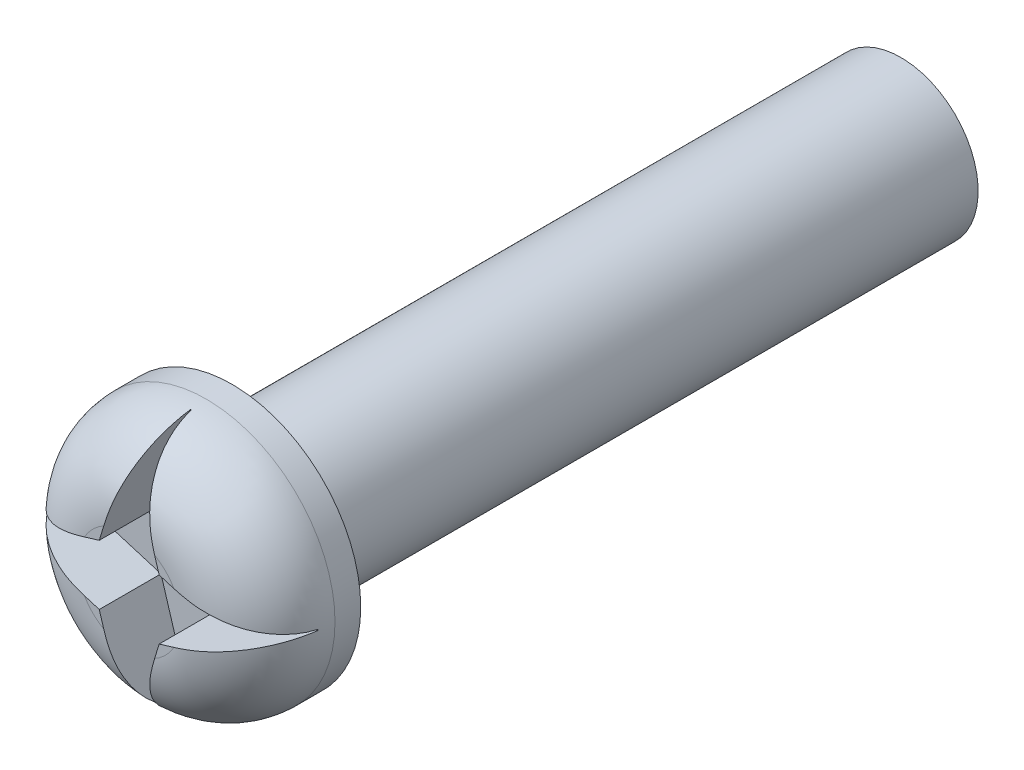
ISO-10303-21;
HEADER;
FILE_DESCRIPTION(('STEP AP214'),'2;1');
FILE_NAME('part.step','',(''),(''),'','','');
FILE_SCHEMA(('AUTOMOTIVE_DESIGN { 1 0 10303 214 1 1 1 1 }'));
ENDSEC;
DATA;
#1=APPLICATION_CONTEXT('core data for automotive mechanical design processes');
#2=APPLICATION_PROTOCOL_DEFINITION('international standard','automotive_design',2000,#1);
#3=PRODUCT_CONTEXT('',#1,'mechanical');
#4=PRODUCT('Part','Part','',(#3));
#5=PRODUCT_RELATED_PRODUCT_CATEGORY('part','',(#4));
#6=PRODUCT_DEFINITION_FORMATION('','',#4);
#7=PRODUCT_DEFINITION_CONTEXT('part definition',#1,'design');
#8=PRODUCT_DEFINITION('design','',#6,#7);
#9=PRODUCT_DEFINITION_SHAPE('','',#8);
#10=(LENGTH_UNIT() NAMED_UNIT(*) SI_UNIT(.MILLI.,.METRE.));
#11=(NAMED_UNIT(*) PLANE_ANGLE_UNIT() SI_UNIT($,.RADIAN.));
#12=(NAMED_UNIT(*) SI_UNIT($,.STERADIAN.) SOLID_ANGLE_UNIT());
#13=UNCERTAINTY_MEASURE_WITH_UNIT(LENGTH_MEASURE(1.E-05),#10,'distance_accuracy_value','');
#14=(GEOMETRIC_REPRESENTATION_CONTEXT(3) GLOBAL_UNCERTAINTY_ASSIGNED_CONTEXT((#13)) GLOBAL_UNIT_ASSIGNED_CONTEXT((#10,
#11,#12)) REPRESENTATION_CONTEXT('',''));
#15=CARTESIAN_POINT('',(0.,0.,0.));
#16=DIRECTION('',(0.,0.,1.));
#17=DIRECTION('',(1.,0.,0.));
#18=AXIS2_PLACEMENT_3D('',#15,#16,#17);
#19=CARTESIAN_POINT('',(0.,0.,15.));
#20=DIRECTION('',(0.,0.,1.));
#21=DIRECTION('',(1.,0.,0.));
#22=AXIS2_PLACEMENT_3D('',#19,#20,#21);
#23=PLANE('',#22);
#24=DIRECTION('',(-0.290235125811715,0.956955365597089,0.));
#25=VECTOR('',#24,1.);
#26=CARTESIAN_POINT('',(0.,2.5,15.));
#27=LINE('',#26,#25);
#28=CARTESIAN_POINT('',(0.581777859539059,0.581777859539081,15.));
#29=VERTEX_POINT('',#28);
#30=CARTESIAN_POINT('',(0.494635776143097,0.869100367598194,15.));
#31=VERTEX_POINT('',#30);
#32=EDGE_CURVE('E158',#29,#31,#27,.T.);
#33=ORIENTED_EDGE('',*,*,#32,.F.);
#34=DIRECTION('',(-0.956955365597085,0.290235125811726,0.));
#35=VECTOR('',#34,1.);
#36=CARTESIAN_POINT('',(2.5,0.,15.));
#37=LINE('',#36,#35);
#38=CARTESIAN_POINT('',(0.869100367598186,0.494635776143112,15.));
#39=VERTEX_POINT('',#38);
#40=EDGE_CURVE('E171',#39,#29,#37,.T.);
#41=ORIENTED_EDGE('',*,*,#40,.F.);
#42=CARTESIAN_POINT('',(0.,0.,15.));
#43=DIRECTION('',(0.,0.,1.));
#44=DIRECTION('',(1.,0.,0.));
#45=AXIS2_PLACEMENT_3D('',#42,#43,#44);
#46=CIRCLE('',#45,1.);
#47=EDGE_CURVE('E191',#39,#31,#46,.T.);
#48=ORIENTED_EDGE('',*,*,#47,.T.);
#49=EDGE_LOOP('',(#33,#41,#48));
#50=FACE_BOUND('',#49,.T.);
#51=ADVANCED_FACE('F33',(#50),#23,.T.);
#52=DIRECTION('',(0.956955365597089,0.290235125811715,0.));
#53=VECTOR('',#52,1.);
#54=CARTESIAN_POINT('',(2.5,0.,15.));
#55=LINE('',#54,#53);
#56=CARTESIAN_POINT('',(0.581777859539066,-0.581777859539073,15.));
#57=VERTEX_POINT('',#56);
#58=CARTESIAN_POINT('',(0.869100367598187,-0.494635776143109,15.));
#59=VERTEX_POINT('',#58);
#60=EDGE_CURVE('E169',#57,#59,#55,.T.);
#61=ORIENTED_EDGE('',*,*,#60,.F.);
#62=DIRECTION('',(0.290235125811725,0.956955365597086,0.));
#63=VECTOR('',#62,1.);
#64=CARTESIAN_POINT('',(0.,-2.5,15.));
#65=LINE('',#64,#63);
#66=CARTESIAN_POINT('',(0.494635776143099,-0.869100367598193,15.));
#67=VERTEX_POINT('',#66);
#68=EDGE_CURVE('E167',#67,#57,#65,.T.);
#69=ORIENTED_EDGE('',*,*,#68,.F.);
#70=EDGE_CURVE('E188',#67,#59,#46,.T.);
#71=ORIENTED_EDGE('',*,*,#70,.T.);
#72=EDGE_LOOP('',(#61,#69,#71));
#73=FACE_BOUND('',#72,.T.);
#74=ADVANCED_FACE('F290',(#73),#23,.T.);
#75=DIRECTION('',(0.290235125811708,-0.956955365597091,0.));
#76=VECTOR('',#75,1.);
#77=CARTESIAN_POINT('',(0.,-2.5,15.));
#78=LINE('',#77,#76);
#79=CARTESIAN_POINT('',(-0.581777859539065,-0.581777859539072,15.));
#80=VERTEX_POINT('',#79);
#81=CARTESIAN_POINT('',(-0.494635776143104,-0.86910036759819,15.));
#82=VERTEX_POINT('',#81);
#83=EDGE_CURVE('E165',#80,#82,#78,.T.);
#84=ORIENTED_EDGE('',*,*,#83,.F.);
#85=DIRECTION('',(0.956955365597084,-0.29023512581173,0.));
#86=VECTOR('',#85,1.);
#87=CARTESIAN_POINT('',(-2.5,0.,15.));
#88=LINE('',#87,#86);
#89=CARTESIAN_POINT('',(-0.869100367598192,-0.494635776143101,15.));
#90=VERTEX_POINT('',#89);
#91=EDGE_CURVE('E163',#90,#80,#88,.T.);
#92=ORIENTED_EDGE('',*,*,#91,.F.);
#93=EDGE_CURVE('E281',#90,#82,#46,.T.);
#94=ORIENTED_EDGE('',*,*,#93,.T.);
#95=EDGE_LOOP('',(#84,#92,#94));
#96=FACE_BOUND('',#95,.T.);
#97=ADVANCED_FACE('F280',(#96),#23,.T.);
#98=CARTESIAN_POINT('',(0.,0.,13.));
#99=DIRECTION('',(0.,0.,-1.));
#100=DIRECTION('',(-1.,0.,0.));
#101=AXIS2_PLACEMENT_3D('',#98,#99,#100);
#102=CYLINDRICAL_SURFACE('',#101,1.5);
#103=CARTESIAN_POINT('',(0.,0.,13.));
#104=DIRECTION('',(0.,0.,1.));
#105=DIRECTION('',(1.,0.,0.));
#106=AXIS2_PLACEMENT_3D('',#103,#104,#105);
#107=CIRCLE('',#106,1.5);
#108=CARTESIAN_POINT('',(-1.5,0.,13.));
#109=VERTEX_POINT('',#108);
#110=EDGE_CURVE('E185',#109,#109,#107,.T.);
#111=CARTESIAN_POINT('',(0.,0.,0.));
#112=DIRECTION('',(0.,0.,1.));
#113=DIRECTION('',(1.,0.,0.));
#114=AXIS2_PLACEMENT_3D('',#111,#112,#113);
#115=CIRCLE('',#114,1.5);
#116=CARTESIAN_POINT('',(-1.5,0.,0.));
#117=VERTEX_POINT('',#116);
#118=EDGE_CURVE('E184',#117,#117,#115,.T.);
#119=CARTESIAN_POINT('',(-1.5,0.,13.));
#120=CARTESIAN_POINT('',(-1.5,0.,12.8645833333333));
#121=CARTESIAN_POINT('',(-1.5,0.,12.7291666666667));
#122=CARTESIAN_POINT('',(-1.5,0.,12.4583333333333));
#123=CARTESIAN_POINT('',(-1.5,0.,12.3229166666667));
#124=CARTESIAN_POINT('',(-1.5,0.,12.0520833333333));
#125=CARTESIAN_POINT('',(-1.5,0.,11.9166666666667));
#126=CARTESIAN_POINT('',(-1.5,0.,11.6458333333333));
#127=CARTESIAN_POINT('',(-1.5,0.,11.5104166666667));
#128=CARTESIAN_POINT('',(-1.5,0.,11.2395833333333));
#129=CARTESIAN_POINT('',(-1.5,0.,11.1041666666667));
#130=CARTESIAN_POINT('',(-1.5,0.,10.8333333333333));
#131=CARTESIAN_POINT('',(-1.5,0.,10.6979166666667));
#132=CARTESIAN_POINT('',(-1.5,0.,10.4270833333333));
#133=CARTESIAN_POINT('',(-1.5,0.,10.2916666666667));
#134=CARTESIAN_POINT('',(-1.5,0.,10.0208333333333));
#135=CARTESIAN_POINT('',(-1.5,0.,9.88541666666667));
#136=CARTESIAN_POINT('',(-1.5,0.,9.61458333333333));
#137=CARTESIAN_POINT('',(-1.5,0.,9.47916666666667));
#138=CARTESIAN_POINT('',(-1.5,0.,9.20833333333333));
#139=CARTESIAN_POINT('',(-1.5,0.,9.07291666666666));
#140=CARTESIAN_POINT('',(-1.5,0.,8.80208333333333));
#141=CARTESIAN_POINT('',(-1.5,0.,8.66666666666667));
#142=CARTESIAN_POINT('',(-1.5,0.,8.39583333333333));
#143=CARTESIAN_POINT('',(-1.5,0.,8.26041666666667));
#144=CARTESIAN_POINT('',(-1.5,0.,7.98958333333333));
#145=CARTESIAN_POINT('',(-1.5,0.,7.85416666666667));
#146=CARTESIAN_POINT('',(-1.5,0.,7.58333333333333));
#147=CARTESIAN_POINT('',(-1.5,0.,7.44791666666667));
#148=CARTESIAN_POINT('',(-1.5,0.,7.17708333333333));
#149=CARTESIAN_POINT('',(-1.5,0.,7.04166666666667));
#150=CARTESIAN_POINT('',(-1.5,0.,6.77083333333333));
#151=CARTESIAN_POINT('',(-1.5,0.,6.63541666666667));
#152=CARTESIAN_POINT('',(-1.5,0.,6.36458333333333));
#153=CARTESIAN_POINT('',(-1.5,0.,6.22916666666667));
#154=CARTESIAN_POINT('',(-1.5,0.,5.95833333333333));
#155=CARTESIAN_POINT('',(-1.5,0.,5.82291666666667));
#156=CARTESIAN_POINT('',(-1.5,0.,5.55208333333333));
#157=CARTESIAN_POINT('',(-1.5,0.,5.41666666666667));
#158=CARTESIAN_POINT('',(-1.5,0.,5.14583333333333));
#159=CARTESIAN_POINT('',(-1.5,0.,5.01041666666667));
#160=CARTESIAN_POINT('',(-1.5,0.,4.73958333333333));
#161=CARTESIAN_POINT('',(-1.5,0.,4.60416666666667));
#162=CARTESIAN_POINT('',(-1.5,0.,4.33333333333333));
#163=CARTESIAN_POINT('',(-1.5,0.,4.19791666666667));
#164=CARTESIAN_POINT('',(-1.5,0.,3.92708333333333));
#165=CARTESIAN_POINT('',(-1.5,0.,3.79166666666667));
#166=CARTESIAN_POINT('',(-1.5,0.,3.52083333333333));
#167=CARTESIAN_POINT('',(-1.5,0.,3.38541666666667));
#168=CARTESIAN_POINT('',(-1.5,0.,3.11458333333333));
#169=CARTESIAN_POINT('',(-1.5,0.,2.97916666666667));
#170=CARTESIAN_POINT('',(-1.5,0.,2.70833333333333));
#171=CARTESIAN_POINT('',(-1.5,0.,2.57291666666667));
#172=CARTESIAN_POINT('',(-1.5,0.,2.30208333333333));
#173=CARTESIAN_POINT('',(-1.5,0.,2.16666666666667));
#174=CARTESIAN_POINT('',(-1.5,0.,1.89583333333333));
#175=CARTESIAN_POINT('',(-1.5,0.,1.76041666666667));
#176=CARTESIAN_POINT('',(-1.5,0.,1.48958333333333));
#177=CARTESIAN_POINT('',(-1.5,0.,1.35416666666667));
#178=CARTESIAN_POINT('',(-1.5,0.,1.08333333333333));
#179=CARTESIAN_POINT('',(-1.5,0.,0.947916666666667));
#180=CARTESIAN_POINT('',(-1.5,0.,0.677083333333334));
#181=CARTESIAN_POINT('',(-1.5,0.,0.541666666666667));
#182=CARTESIAN_POINT('',(-1.5,0.,0.270833333333334));
#183=CARTESIAN_POINT('',(-1.5,0.,0.135416666666667));
#184=CARTESIAN_POINT('',(-1.5,0.,0.));
#185=B_SPLINE_CURVE_WITH_KNOTS('',3,(#119,#120,#121,#122,#123,#124,#125,#126,#127,#128,#129,
#130,#131,#132,#133,#134,#135,#136,#137,#138,#139,#140,#141,#142,#143,#144,#145,#146,#147,#148,
#149,#150,#151,#152,#153,#154,#155,#156,#157,#158,#159,#160,#161,#162,#163,#164,#165,#166,#167,
#168,#169,#170,#171,#172,#173,#174,#175,#176,#177,#178,#179,#180,#181,#182,#183,#184),
.UNSPECIFIED.,.F.,.F.,(4,2,2,2,2,2,2,2,2,2,2,2,2,2,2,2,2,2,2,2,2,2,2,2,2,2,2,2,2,2,2,2,4),(0.,
0.40625,0.812500000000001,1.21875,1.625,2.03125,2.4375,2.84375,3.25,3.65625,4.0625,4.46875,
4.875,5.28125,5.6875,6.09375,6.5,6.90625,7.3125,7.71875,8.125,8.53125,8.9375,9.34375,9.75,
10.15625,10.5625,10.96875,11.375,11.78125,12.1875,12.59375,13.),.UNSPECIFIED.);
#186=EDGE_CURVE('BSEAM321',#109,#117,#185,.T.);
#187=ORIENTED_EDGE('',*,*,#110,.F.);
#188=ORIENTED_EDGE('',*,*,#118,.T.);
#189=ORIENTED_EDGE('',*,*,#186,.T.);
#190=ORIENTED_EDGE('',*,*,#186,.F.);
#191=EDGE_LOOP('',(#187,#189,#188,#190));
#192=FACE_BOUND('',#191,.T.);
#193=ADVANCED_FACE('F321',(#192),#102,.T.);
#194=CARTESIAN_POINT('',(0.,0.,0.));
#195=DIRECTION('',(0.,0.,1.));
#196=DIRECTION('',(1.,0.,0.));
#197=AXIS2_PLACEMENT_3D('',#194,#195,#196);
#198=PLANE('',#197);
#199=ORIENTED_EDGE('',*,*,#118,.F.);
#200=EDGE_LOOP('',(#199));
#201=FACE_BOUND('',#200,.T.);
#202=ADVANCED_FACE('F316',(#201),#198,.F.);
#203=CARTESIAN_POINT('',(0.,0.,15.));
#204=DIRECTION('',(0.,0.,-1.));
#205=DIRECTION('',(-1.,0.,0.));
#206=AXIS2_PLACEMENT_3D('',#203,#204,#205);
#207=CYLINDRICAL_SURFACE('',#206,2.5);
#208=CARTESIAN_POINT('',(0.,0.,13.5));
#209=DIRECTION('',(0.,0.,1.));
#210=DIRECTION('',(1.,0.,0.));
#211=AXIS2_PLACEMENT_3D('',#208,#209,#210);
#212=CIRCLE('',#211,2.5);
#213=CARTESIAN_POINT('',(2.5,0.,13.5));
#214=VERTEX_POINT('',#213);
#215=EDGE_CURVE('E194',#214,#214,#212,.F.);
#216=ORIENTED_EDGE('',*,*,#215,.T.);
#217=EDGE_LOOP('',(#216));
#218=FACE_BOUND('',#217,.T.);
#219=CARTESIAN_POINT('',(0.,0.,13.));
#220=DIRECTION('',(0.,0.,1.));
#221=DIRECTION('',(1.,0.,0.));
#222=AXIS2_PLACEMENT_3D('',#219,#220,#221);
#223=CIRCLE('',#222,2.5);
#224=CARTESIAN_POINT('',(2.5,0.,13.));
#225=VERTEX_POINT('',#224);
#226=EDGE_CURVE('E176',#225,#225,#223,.T.);
#227=ORIENTED_EDGE('',*,*,#226,.T.);
#228=EDGE_LOOP('',(#227));
#229=FACE_BOUND('',#228,.T.);
#230=ADVANCED_FACE('F309',(#218,#229),#207,.T.);
#231=DIRECTION('',(-0.956955365597088,-0.290235125811717,0.));
#232=VECTOR('',#231,1.);
#233=CARTESIAN_POINT('',(-2.5,0.,15.));
#234=LINE('',#233,#232);
#235=CARTESIAN_POINT('',(-0.581777859539079,0.581777859539089,15.));
#236=VERTEX_POINT('',#235);
#237=CARTESIAN_POINT('',(-0.869100367598174,0.494635776143133,15.));
#238=VERTEX_POINT('',#237);
#239=EDGE_CURVE('E161',#236,#238,#234,.T.);
#240=ORIENTED_EDGE('',*,*,#239,.F.);
#241=DIRECTION('',(-0.290235125811725,-0.956955365597086,0.));
#242=VECTOR('',#241,1.);
#243=CARTESIAN_POINT('',(0.,2.5,15.));
#244=LINE('',#243,#242);
#245=CARTESIAN_POINT('',(-0.494635776143121,0.86910036759818,15.));
#246=VERTEX_POINT('',#245);
#247=EDGE_CURVE('E134',#246,#236,#244,.T.);
#248=ORIENTED_EDGE('',*,*,#247,.F.);
#249=EDGE_CURVE('E195',#246,#238,#46,.T.);
#250=ORIENTED_EDGE('',*,*,#249,.T.);
#251=EDGE_LOOP('',(#240,#248,#250));
#252=FACE_BOUND('',#251,.T.);
#253=ADVANCED_FACE('F306',(#252),#23,.T.);
#254=CARTESIAN_POINT('',(0.,0.,13.));
#255=DIRECTION('',(0.,0.,1.));
#256=DIRECTION('',(1.,0.,0.));
#257=AXIS2_PLACEMENT_3D('',#254,#255,#256);
#258=PLANE('',#257);
#259=ORIENTED_EDGE('',*,*,#110,.T.);
#260=EDGE_LOOP('',(#259));
#261=FACE_BOUND('',#260,.T.);
#262=ORIENTED_EDGE('',*,*,#226,.F.);
#263=EDGE_LOOP('',(#262));
#264=FACE_BOUND('',#263,.T.);
#265=ADVANCED_FACE('F308',(#261,#264),#258,.F.);
#266=CARTESIAN_POINT('',(0.,0.,13.5));
#267=DIRECTION('',(0.,0.,1.));
#268=DIRECTION('',(1.,0.,0.));
#269=AXIS2_PLACEMENT_3D('',#266,#267,#268);
#270=DEGENERATE_TOROIDAL_SURFACE('',#269,1.,1.5,.T.);
#271=CARTESIAN_POINT('',(0.00918435966308323,-2.46971757903322,13.7998));
#272=CARTESIAN_POINT('',(0.0116689254568649,-2.46152553625105,13.8399158307009));
#273=CARTESIAN_POINT('',(0.0146506114956408,-2.45169440211333,13.8796452640202));
#274=CARTESIAN_POINT('',(0.0215841220095333,-2.42883341976277,13.9580805517623));
#275=CARTESIAN_POINT('',(0.0255358195102427,-2.4158039902065,13.9967865394199));
#276=CARTESIAN_POINT('',(0.0387833561288206,-2.37212457265621,14.1107713827401));
#277=CARTESIAN_POINT('',(0.0494874506514517,-2.33683132323079,14.1841703739703));
#278=CARTESIAN_POINT('',(0.0743045561283554,-2.25500503780689,14.3237199604718));
#279=CARTESIAN_POINT('',(0.0884178684534007,-2.20847100813689,14.3898699141849));
#280=CARTESIAN_POINT('',(0.11962433264048,-2.10557790289465,14.5132721809844));
#281=CARTESIAN_POINT('',(0.136718946680849,-2.04921400626777,14.5705201018888));
#282=CARTESIAN_POINT('',(0.17368852549128,-1.92731891618327,14.675666432706));
#283=CARTESIAN_POINT('',(0.193607438159992,-1.86164281890913,14.7233809435215));
#284=CARTESIAN_POINT('',(0.235361492228295,-1.72397248708991,14.807248507459));
#285=CARTESIAN_POINT('',(0.257194662274962,-1.65198475243609,14.8434132806364));
#286=CARTESIAN_POINT('',(0.303460286761772,-1.49943899329847,14.9057396867572));
#287=CARTESIAN_POINT('',(0.32796994983838,-1.41862639859775,14.9312154644709));
#288=CARTESIAN_POINT('',(0.377862710195557,-1.25412134568688,14.9697719126354));
#289=CARTESIAN_POINT('',(0.403248465796886,-1.1704201225338,14.9828106428413));
#290=CARTESIAN_POINT('',(0.441523148700105,-1.04422187871916,14.9944644251529));
#291=CARTESIAN_POINT('',(0.454329305113352,-1.00199776798116,14.9970299725043));
#292=CARTESIAN_POINT('',(0.479969007432001,-0.917459238616312,14.9999414912261));
#293=CARTESIAN_POINT('',(0.49280256284035,-0.875144788656615,15.0002864949861));
#294=CARTESIAN_POINT('',(0.518351428991135,-0.7909057618347,14.9992780548217));
#295=CARTESIAN_POINT('',(0.531066818032052,-0.748980926808863,14.9979390152647));
#296=CARTESIAN_POINT('',(0.556469860848575,-0.665222704719872,14.9942759239134));
#297=CARTESIAN_POINT('',(0.569157529205893,-0.623389269578297,14.9919531521182));
#298=CARTESIAN_POINT('',(0.581838517566858,-0.581577859539073,14.9894799069656));
#299=B_SPLINE_CURVE_WITH_KNOTS('',3,(#271,#272,#273,#274,#275,#276,#277,#278,#279,#280,#281,
#282,#283,#284,#285,#286,#287,#288,#289,#290,#291,#292,#293,#294,#295,#296,#297,#298),
.UNSPECIFIED.,.F.,.F.,(4,2,2,2,2,2,2,2,2,2,2,2,2,4),(0.,0.122979479011578,0.245942868597718,
0.491102580751686,0.736283972666619,0.98158595361853,1.23124007487557,1.48064004956038,
1.74422362424766,2.00869294616106,2.14124133579937,2.27384747999228,2.4053270604389,
2.53663608717397),.UNSPECIFIED.);
#300=CARTESIAN_POINT('',(0.00919675120337278,-2.46967672198349,13.8));
#301=VERTEX_POINT('',#300);
#302=EDGE_CURVE('E11',#301,#67,#299,.T.);
#303=ORIENTED_EDGE('',*,*,#302,.F.);
#304=CARTESIAN_POINT('',(0.,0.,13.8));
#305=DIRECTION('',(0.,0.,-1.));
#306=DIRECTION('',(-1.,0.,0.));
#307=AXIS2_PLACEMENT_3D('',#304,#305,#306);
#308=CIRCLE('',#307,2.46969384566991);
#309=CARTESIAN_POINT('',(-0.00919675120340704,-2.46967672198349,13.8));
#310=VERTEX_POINT('',#309);
#311=EDGE_CURVE('E200',#310,#301,#308,.F.);
#312=ORIENTED_EDGE('',*,*,#311,.F.);
#313=CARTESIAN_POINT('',(-0.581838517566857,-0.581577859539072,14.9894799069656));
#314=CARTESIAN_POINT('',(-0.571854317041364,-0.614497494050391,14.9914177425874));
#315=CARTESIAN_POINT('',(-0.561867347937281,-0.647426257043762,14.9932729937084));
#316=CARTESIAN_POINT('',(-0.541880692645481,-0.713325713452892,14.9964682716288));
#317=CARTESIAN_POINT('',(-0.531881002420983,-0.746296420178618,14.9978079872785));
#318=CARTESIAN_POINT('',(-0.511820221816503,-0.812440280553318,14.9996238023838));
#319=CARTESIAN_POINT('',(-0.501759089225624,-0.845613573378915,15.0000952419186));
#320=CARTESIAN_POINT('',(-0.481640096252261,-0.911949369993555,14.999872200587));
#321=CARTESIAN_POINT('',(-0.471582235616266,-0.945111874618466,14.999177950472));
#322=CARTESIAN_POINT('',(-0.441227455058568,-1.04519683175442,14.9949427007751));
#323=CARTESIAN_POINT('',(-0.420948919117767,-1.11205866910347,14.9892205893121));
#324=CARTESIAN_POINT('',(-0.380706061496062,-1.24474632508703,14.9705892435361));
#325=CARTESIAN_POINT('',(-0.360741114782743,-1.31057420456143,14.9576968850162));
#326=CARTESIAN_POINT('',(-0.328390488332209,-1.41723981051,14.9299833887052));
#327=CARTESIAN_POINT('',(-0.31583600421662,-1.45863411419091,14.9174813775928));
#328=CARTESIAN_POINT('',(-0.291050007945186,-1.54035782718837,14.8890935834674));
#329=CARTESIAN_POINT('',(-0.278818613993136,-1.58068684676658,14.8732065807982));
#330=CARTESIAN_POINT('',(-0.24286806178958,-1.69922203002931,14.8205564311957));
#331=CARTESIAN_POINT('',(-0.219753991502933,-1.77543311412788,14.7786884332639));
#332=CARTESIAN_POINT('',(-0.175859446868908,-1.92016101324242,14.6815779100086));
#333=CARTESIAN_POINT('',(-0.155091689548701,-1.98863589802216,14.6262671838248));
#334=CARTESIAN_POINT('',(-0.11672489782775,-2.11513784052628,14.5035732660385));
#335=CARTESIAN_POINT('',(-0.0991316598274772,-2.17314578651663,14.4361684301891));
#336=CARTESIAN_POINT('',(-0.0687666394979736,-2.27326450594976,14.2957637953369));
#337=CARTESIAN_POINT('',(-0.0557691957928466,-2.31611932394563,14.2233408876231));
#338=CARTESIAN_POINT('',(-0.0336611591193402,-2.38901334136809,14.0719038417731));
#339=CARTESIAN_POINT('',(-0.024540647679244,-2.41908524370996,13.9929071489943));
#340=CARTESIAN_POINT('',(-0.0159018242744796,-2.44756893735839,13.8934073664307));
#341=CARTESIAN_POINT('',(-0.0144046614510589,-2.45250534191328,13.8748048523567));
#342=CARTESIAN_POINT('',(-0.011630272761113,-2.46165298086866,13.8374305848339));
#343=CARTESIAN_POINT('',(-0.0103527776068854,-2.46586510315725,13.8186590687182));
#344=CARTESIAN_POINT('',(-0.00918435966311663,-2.46971757903322,13.7998));
#345=B_SPLINE_CURVE_WITH_KNOTS('',3,(#313,#314,#315,#316,#317,#318,#319,#320,#321,#322,#323,
#324,#325,#326,#327,#328,#329,#330,#331,#332,#333,#334,#335,#336,#337,#338,#339,#340,#341,#342,
#343,#344),.UNSPECIFIED.,.F.,.F.,(4,2,2,2,2,2,2,2,2,2,2,2,2,2,2,4),(0.,0.103372404843998,
0.20680710228705,0.310795320048929,0.414762955476854,0.624757611582251,0.83426010606153,
0.969206963887304,1.1042025272893,1.37273742142197,1.64266424407984,1.91307904970278,
2.16729791208936,2.42086242629322,2.47876756279611,2.53660120009338),.UNSPECIFIED.);
#346=EDGE_CURVE('E46',#82,#310,#345,.T.);
#347=ORIENTED_EDGE('',*,*,#346,.F.);
#348=ORIENTED_EDGE('',*,*,#93,.F.);
#349=CARTESIAN_POINT('',(-2.46971757903322,-0.00918435966307469,13.7998));
#350=CARTESIAN_POINT('',(-2.46152553625105,-0.0116689254568564,13.8399158307009));
#351=CARTESIAN_POINT('',(-2.45169440211333,-0.0146506114956325,13.8796452640202));
#352=CARTESIAN_POINT('',(-2.42883341976277,-0.0215841220095251,13.9580805517623));
#353=CARTESIAN_POINT('',(-2.4158039902065,-0.0255358195102347,13.9967865394199));
#354=CARTESIAN_POINT('',(-2.37212457265621,-0.0387833561288129,14.1107713827401));
#355=CARTESIAN_POINT('',(-2.33683132323079,-0.0494874506514442,14.1841703739703));
#356=CARTESIAN_POINT('',(-2.25500503780689,-0.0743045561283486,14.3237199604718));
#357=CARTESIAN_POINT('',(-2.20847100813689,-0.0884178684533943,14.3898699141849));
#358=CARTESIAN_POINT('',(-2.10557790289465,-0.119624332640475,14.5132721809844));
#359=CARTESIAN_POINT('',(-2.04921400626777,-0.136718946680843,14.5705201018888));
#360=CARTESIAN_POINT('',(-1.92731891618327,-0.173688525491276,14.675666432706));
#361=CARTESIAN_POINT('',(-1.86164281890913,-0.193607438159988,14.7233809435215));
#362=CARTESIAN_POINT('',(-1.72397248708991,-0.235361492228292,14.807248507459));
#363=CARTESIAN_POINT('',(-1.65198475243609,-0.25719466227496,14.8434132806365));
#364=CARTESIAN_POINT('',(-1.49943899329847,-0.30346028676177,14.9057396867572));
#365=CARTESIAN_POINT('',(-1.41862639859774,-0.327969949838379,14.9312154644709));
#366=CARTESIAN_POINT('',(-1.25412134568688,-0.377862710195556,14.9697719126354));
#367=CARTESIAN_POINT('',(-1.1704201225338,-0.403248465796886,14.9828106428413));
#368=CARTESIAN_POINT('',(-1.04422187871916,-0.441523148700106,14.9944644251529));
#369=CARTESIAN_POINT('',(-1.00199776798115,-0.454329305113353,14.9970299725043));
#370=CARTESIAN_POINT('',(-0.917459238616308,-0.479969007432004,14.9999414912261));
#371=CARTESIAN_POINT('',(-0.875144788656611,-0.492802562840352,15.0002864949861));
#372=CARTESIAN_POINT('',(-0.790905761834695,-0.518351428991139,14.9992780548217));
#373=CARTESIAN_POINT('',(-0.748980926808857,-0.531066818032056,14.9979390152647));
#374=CARTESIAN_POINT('',(-0.665222704719865,-0.55646986084858,14.9942759239134));
#375=CARTESIAN_POINT('',(-0.623389269578289,-0.569157529205899,14.9919531521182));
#376=CARTESIAN_POINT('',(-0.581577859539065,-0.581838517566864,14.9894799069656));
#377=B_SPLINE_CURVE_WITH_KNOTS('',3,(#349,#350,#351,#352,#353,#354,#355,#356,#357,#358,#359,
#360,#361,#362,#363,#364,#365,#366,#367,#368,#369,#370,#371,#372,#373,#374,#375,#376),
.UNSPECIFIED.,.F.,.F.,(4,2,2,2,2,2,2,2,2,2,2,2,2,4),(0.,0.122979479011579,0.24594286859772,
0.491102580751688,0.736283972666622,0.981585953618533,1.23124007487557,1.48064004956038,
1.74422362424767,2.00869294616107,2.14124133579937,2.27384747999229,2.40532706043891,
2.53663608717398),.UNSPECIFIED.);
#378=CARTESIAN_POINT('',(-2.46967672198349,-0.00919675120336411,13.8));
#379=VERTEX_POINT('',#378);
#380=EDGE_CURVE('E206',#379,#90,#377,.T.);
#381=ORIENTED_EDGE('',*,*,#380,.F.);
#382=CARTESIAN_POINT('',(-2.46967672198349,0.00919675120341615,13.8));
#383=VERTEX_POINT('',#382);
#384=EDGE_CURVE('E198',#383,#379,#308,.F.);
#385=ORIENTED_EDGE('',*,*,#384,.F.);
#386=CARTESIAN_POINT('',(-0.581577859539079,0.581838517566882,14.9894799069656));
#387=CARTESIAN_POINT('',(-0.614497494050399,0.571854317041388,14.9914177425874));
#388=CARTESIAN_POINT('',(-0.647426257043771,0.561867347937304,14.9932729937084));
#389=CARTESIAN_POINT('',(-0.713325713452903,0.541880692645503,14.9964682716288));
#390=CARTESIAN_POINT('',(-0.746296420178629,0.531881002421005,14.9978079872785));
#391=CARTESIAN_POINT('',(-0.812440280553331,0.511820221816524,14.9996238023838));
#392=CARTESIAN_POINT('',(-0.845613573378929,0.501759089225644,15.0000952419186));
#393=CARTESIAN_POINT('',(-0.91194936999357,0.48164009625228,14.999872200587));
#394=CARTESIAN_POINT('',(-0.945111874618483,0.471582235616285,14.999177950472));
#395=CARTESIAN_POINT('',(-1.04519683175444,0.441227455058584,14.9949427007751));
#396=CARTESIAN_POINT('',(-1.11205866910349,0.420948919117782,14.9892205893121));
#397=CARTESIAN_POINT('',(-1.24474632508705,0.380706061496075,14.970589243536));
#398=CARTESIAN_POINT('',(-1.31057420456145,0.360741114782756,14.9576968850162));
#399=CARTESIAN_POINT('',(-1.41723981051003,0.32839048833222,14.9299833887052));
#400=CARTESIAN_POINT('',(-1.45863411419093,0.315836004216631,14.9174813775928));
#401=CARTESIAN_POINT('',(-1.54035782718839,0.291050007945196,14.8890935834674));
#402=CARTESIAN_POINT('',(-1.58068684676661,0.278818613993147,14.8732065807982));
#403=CARTESIAN_POINT('',(-1.69922203002933,0.24286806178959,14.8205564311957));
#404=CARTESIAN_POINT('',(-1.7754331141279,0.219753991502942,14.7786884332638));
#405=CARTESIAN_POINT('',(-1.92016101324244,0.175859446868916,14.6815779100086));
#406=CARTESIAN_POINT('',(-1.98863589802218,0.155091689548708,14.6262671838248));
#407=CARTESIAN_POINT('',(-2.1151378405263,0.116724897827757,14.5035732660384));
#408=CARTESIAN_POINT('',(-2.17314578651664,0.0991316598274845,14.4361684301891));
#409=CARTESIAN_POINT('',(-2.27326450594978,0.0687666394979806,14.2957637953368));
#410=CARTESIAN_POINT('',(-2.31611932394564,0.0557691957928535,14.2233408876231));
#411=CARTESIAN_POINT('',(-2.3890133413681,0.033661159119347,14.0719038417731));
#412=CARTESIAN_POINT('',(-2.41908524370997,0.0245406476792509,13.9929071489943));
#413=CARTESIAN_POINT('',(-2.4475689373584,0.0159018242744871,13.8934073664307));
#414=CARTESIAN_POINT('',(-2.45250534191328,0.0144046614510669,13.8748048523566));
#415=CARTESIAN_POINT('',(-2.46165298086866,0.0116302727611216,13.8374305848339));
#416=CARTESIAN_POINT('',(-2.46586510315725,0.0103527776068943,13.8186590687182));
#417=CARTESIAN_POINT('',(-2.46971757903322,0.00918435966312577,13.7998));
#418=B_SPLINE_CURVE_WITH_KNOTS('',3,(#386,#387,#388,#389,#390,#391,#392,#393,#394,#395,#396,
#397,#398,#399,#400,#401,#402,#403,#404,#405,#406,#407,#408,#409,#410,#411,#412,#413,#414,#415,
#416,#417),.UNSPECIFIED.,.F.,.F.,(4,2,2,2,2,2,2,2,2,2,2,2,2,2,2,4),(0.,0.103372404844,
0.206807102287055,0.310795320048937,0.414762955476865,0.624757611582268,0.834260106061552,
0.969206963887325,1.10420252728932,1.37273742142199,1.64266424407986,1.9130790497028,
2.16729791208938,2.42086242629324,2.47876756279612,2.53660120009338),.UNSPECIFIED.);
#419=EDGE_CURVE('E142',#238,#383,#418,.T.);
#420=ORIENTED_EDGE('',*,*,#419,.F.);
#421=ORIENTED_EDGE('',*,*,#249,.F.);
#422=CARTESIAN_POINT('',(-0.00918435966310069,2.46971757903322,13.7998));
#423=CARTESIAN_POINT('',(-0.0116689254568823,2.46152553625105,13.8399158307009));
#424=CARTESIAN_POINT('',(-0.0146506114956583,2.45169440211333,13.8796452640202));
#425=CARTESIAN_POINT('',(-0.0215841220095508,2.42883341976277,13.9580805517623));
#426=CARTESIAN_POINT('',(-0.0255358195102602,2.4158039902065,13.9967865394199));
#427=CARTESIAN_POINT('',(-0.0387833561288382,2.37212457265621,14.1107713827401));
#428=CARTESIAN_POINT('',(-0.0494874506514692,2.33683132323079,14.1841703739703));
#429=CARTESIAN_POINT('',(-0.0743045561283732,2.25500503780689,14.3237199604718));
#430=CARTESIAN_POINT('',(-0.0884178684534186,2.20847100813689,14.3898699141849));
#431=CARTESIAN_POINT('',(-0.119624332640498,2.10557790289465,14.5132721809844));
#432=CARTESIAN_POINT('',(-0.136718946680866,2.04921400626777,14.5705201018888));
#433=CARTESIAN_POINT('',(-0.173688525491298,1.92731891618327,14.675666432706));
#434=CARTESIAN_POINT('',(-0.19360743816001,1.86164281890913,14.7233809435215));
#435=CARTESIAN_POINT('',(-0.235361492228313,1.72397248708991,14.807248507459));
#436=CARTESIAN_POINT('',(-0.257194662274981,1.65198475243609,14.8434132806364));
#437=CARTESIAN_POINT('',(-0.30346028676179,1.49943899329847,14.9057396867572));
#438=CARTESIAN_POINT('',(-0.327969949838398,1.41862639859774,14.9312154644709));
#439=CARTESIAN_POINT('',(-0.377862710195575,1.25412134568688,14.9697719126354));
#440=CARTESIAN_POINT('',(-0.403248465796904,1.1704201225338,14.9828106428413));
#441=CARTESIAN_POINT('',(-0.441523148700123,1.04422187871916,14.9944644251529));
#442=CARTESIAN_POINT('',(-0.454329305113369,1.00199776798116,14.9970299725043));
#443=CARTESIAN_POINT('',(-0.479969007432018,0.917459238616316,14.9999414912261));
#444=CARTESIAN_POINT('',(-0.492802562840366,0.875144788656621,15.0002864949862));
#445=CARTESIAN_POINT('',(-0.51835142899115,0.790905761834709,14.9992780548217));
#446=CARTESIAN_POINT('',(-0.531066818032067,0.748980926808873,14.9979390152647));
#447=CARTESIAN_POINT('',(-0.556469860848589,0.665222704719885,14.9942759239134));
#448=CARTESIAN_POINT('',(-0.569157529205907,0.623389269578311,14.9919531521182));
#449=CARTESIAN_POINT('',(-0.581838517566871,0.581577859539089,14.9894799069656));
#450=B_SPLINE_CURVE_WITH_KNOTS('',3,(#422,#423,#424,#425,#426,#427,#428,#429,#430,#431,#432,
#433,#434,#435,#436,#437,#438,#439,#440,#441,#442,#443,#444,#445,#446,#447,#448,#449),
.UNSPECIFIED.,.F.,.F.,(4,2,2,2,2,2,2,2,2,2,2,2,2,4),(0.,0.122979479011578,0.245942868597718,
0.491102580751686,0.73628397266662,0.981585953618531,1.23124007487557,1.48064004956038,
1.74422362424766,2.00869294616106,2.14124133579936,2.27384747999227,2.40532706043889,
2.53663608717395),.UNSPECIFIED.);
#451=CARTESIAN_POINT('',(-0.00919675120339023,2.46967672198349,13.8));
#452=VERTEX_POINT('',#451);
#453=EDGE_CURVE('E224',#452,#246,#450,.T.);
#454=ORIENTED_EDGE('',*,*,#453,.F.);
#455=CARTESIAN_POINT('',(0.00919675120338991,2.46967672198349,13.8));
#456=VERTEX_POINT('',#455);
#457=EDGE_CURVE('E59',#456,#452,#308,.F.);
#458=ORIENTED_EDGE('',*,*,#457,.F.);
#459=CARTESIAN_POINT('',(0.581838517566851,0.581577859539081,14.9894799069656));
#460=CARTESIAN_POINT('',(0.571854317041357,0.6144974940504,14.9914177425874));
#461=CARTESIAN_POINT('',(0.561867347937274,0.647426257043771,14.9932729937084));
#462=CARTESIAN_POINT('',(0.541880692645474,0.713325713452902,14.9964682716288));
#463=CARTESIAN_POINT('',(0.531881002420976,0.746296420178627,14.9978079872785));
#464=CARTESIAN_POINT('',(0.511820221816495,0.812440280553328,14.9996238023838));
#465=CARTESIAN_POINT('',(0.501759089225615,0.845613573378925,15.0000952419186));
#466=CARTESIAN_POINT('',(0.481640096252252,0.911949369993564,14.999872200587));
#467=CARTESIAN_POINT('',(0.471582235616257,0.945111874618476,14.999177950472));
#468=CARTESIAN_POINT('',(0.441227455058558,1.04519683175443,14.9949427007751));
#469=CARTESIAN_POINT('',(0.420948919117756,1.11205866910348,14.9892205893121));
#470=CARTESIAN_POINT('',(0.380706061496051,1.24474632508704,14.9705892435361));
#471=CARTESIAN_POINT('',(0.360741114782732,1.31057420456144,14.9576968850162));
#472=CARTESIAN_POINT('',(0.328390488332196,1.41723981051001,14.9299833887052));
#473=CARTESIAN_POINT('',(0.315836004216607,1.45863411419092,14.9174813775928));
#474=CARTESIAN_POINT('',(0.291050007945172,1.54035782718838,14.8890935834674));
#475=CARTESIAN_POINT('',(0.278818613993123,1.58068684676659,14.8732065807982));
#476=CARTESIAN_POINT('',(0.242868061789566,1.69922203002932,14.8205564311957));
#477=CARTESIAN_POINT('',(0.219753991502919,1.77543311412789,14.7786884332639));
#478=CARTESIAN_POINT('',(0.175859446868892,1.92016101324242,14.6815779100086));
#479=CARTESIAN_POINT('',(0.155091689548685,1.98863589802216,14.6262671838248));
#480=CARTESIAN_POINT('',(0.116724897827733,2.11513784052629,14.5035732660385));
#481=CARTESIAN_POINT('',(0.0991316598274606,2.17314578651663,14.4361684301891));
#482=CARTESIAN_POINT('',(0.0687666394979565,2.27326450594977,14.2957637953369));
#483=CARTESIAN_POINT('',(0.0557691957928293,2.31611932394563,14.2233408876231));
#484=CARTESIAN_POINT('',(0.0336611591193226,2.38901334136809,14.0719038417731));
#485=CARTESIAN_POINT('',(0.0245406476792264,2.41908524370996,13.9929071489943));
#486=CARTESIAN_POINT('',(0.0159018242744619,2.44756893735839,13.8934073664307));
#487=CARTESIAN_POINT('',(0.0144046614510413,2.45250534191328,13.8748048523567));
#488=CARTESIAN_POINT('',(0.0116302727610956,2.46165298086866,13.8374305848339));
#489=CARTESIAN_POINT('',(0.0103527776068681,2.46586510315725,13.8186590687182));
#490=CARTESIAN_POINT('',(0.00918435966309952,2.46971757903322,13.7998));
#491=B_SPLINE_CURVE_WITH_KNOTS('',3,(#459,#460,#461,#462,#463,#464,#465,#466,#467,#468,#469,
#470,#471,#472,#473,#474,#475,#476,#477,#478,#479,#480,#481,#482,#483,#484,#485,#486,#487,#488,
#489,#490),.UNSPECIFIED.,.F.,.F.,(4,2,2,2,2,2,2,2,2,2,2,2,2,2,2,4),(0.,0.103372404843998,
0.20680710228705,0.31079532004893,0.414762955476855,0.624757611582253,0.834260106061532,
0.969206963887307,1.1042025272893,1.37273742142197,1.64266424407984,1.91307904970278,
2.16729791208936,2.42086242629322,2.47876756279611,2.53660120009338),.UNSPECIFIED.);
#492=EDGE_CURVE('E229',#31,#456,#491,.T.);
#493=ORIENTED_EDGE('',*,*,#492,.F.);
#494=ORIENTED_EDGE('',*,*,#47,.F.);
#495=CARTESIAN_POINT('',(2.46971757903322,0.00918435966309198,13.7998));
#496=CARTESIAN_POINT('',(2.46152553625105,0.0116689254568736,13.8399158307009));
#497=CARTESIAN_POINT('',(2.45169440211333,0.0146506114956497,13.8796452640202));
#498=CARTESIAN_POINT('',(2.42883341976277,0.0215841220095422,13.9580805517623));
#499=CARTESIAN_POINT('',(2.4158039902065,0.0255358195102517,13.9967865394199));
#500=CARTESIAN_POINT('',(2.3721245726562,0.0387833561288299,14.1107713827401));
#501=CARTESIAN_POINT('',(2.33683132323079,0.049487450651461,14.1841703739703));
#502=CARTESIAN_POINT('',(2.25500503780689,0.0743045561283652,14.3237199604718));
#503=CARTESIAN_POINT('',(2.20847100813688,0.0884178684534108,14.3898699141849));
#504=CARTESIAN_POINT('',(2.10557790289465,0.119624332640491,14.5132721809844));
#505=CARTESIAN_POINT('',(2.04921400626777,0.136718946680859,14.5705201018888));
#506=CARTESIAN_POINT('',(1.92731891618327,0.173688525491291,14.675666432706));
#507=CARTESIAN_POINT('',(1.86164281890912,0.193607438160003,14.7233809435215));
#508=CARTESIAN_POINT('',(1.7239724870899,0.235361492228306,14.807248507459));
#509=CARTESIAN_POINT('',(1.65198475243609,0.257194662274974,14.8434132806365));
#510=CARTESIAN_POINT('',(1.49943899329847,0.303460286761783,14.9057396867572));
#511=CARTESIAN_POINT('',(1.41862639859774,0.327969949838391,14.9312154644709));
#512=CARTESIAN_POINT('',(1.25412134568687,0.377862710195568,14.9697719126354));
#513=CARTESIAN_POINT('',(1.1704201225338,0.403248465796898,14.9828106428413));
#514=CARTESIAN_POINT('',(1.04422187871915,0.441523148700117,14.9944644251529));
#515=CARTESIAN_POINT('',(1.00199776798115,0.454329305113364,14.9970299725043));
#516=CARTESIAN_POINT('',(0.917459238616303,0.479969007432014,14.9999414912261));
#517=CARTESIAN_POINT('',(0.875144788656605,0.492802562840363,15.0002864949861));
#518=CARTESIAN_POINT('',(0.790905761834689,0.518351428991149,14.9992780548217));
#519=CARTESIAN_POINT('',(0.748980926808851,0.531066818032066,14.9979390152647));
#520=CARTESIAN_POINT('',(0.665222704719858,0.55646986084859,14.9942759239134));
#521=CARTESIAN_POINT('',(0.623389269578283,0.569157529205908,14.9919531521182));
#522=CARTESIAN_POINT('',(0.581577859539058,0.581838517566873,14.9894799069656));
#523=B_SPLINE_CURVE_WITH_KNOTS('',3,(#495,#496,#497,#498,#499,#500,#501,#502,#503,#504,#505,
#506,#507,#508,#509,#510,#511,#512,#513,#514,#515,#516,#517,#518,#519,#520,#521,#522),
.UNSPECIFIED.,.F.,.F.,(4,2,2,2,2,2,2,2,2,2,2,2,2,4),(0.,0.122979479011579,0.24594286859772,
0.49110258075169,0.736283972666625,0.981585953618536,1.23124007487557,1.48064004956038,
1.74422362424767,2.00869294616107,2.14124133579937,2.27384747999229,2.40532706043891,
2.53663608717398),.UNSPECIFIED.);
#524=CARTESIAN_POINT('',(2.46967672198349,0.00919675120338145,13.8));
#525=VERTEX_POINT('',#524);
#526=EDGE_CURVE('E241',#525,#39,#523,.T.);
#527=ORIENTED_EDGE('',*,*,#526,.F.);
#528=CARTESIAN_POINT('',(2.46967672198349,-0.00919675120339869,13.8));
#529=VERTEX_POINT('',#528);
#530=EDGE_CURVE('E234',#529,#525,#308,.F.);
#531=ORIENTED_EDGE('',*,*,#530,.F.);
#532=CARTESIAN_POINT('',(0.581577859539066,-0.581838517566865,14.9894799069656));
#533=CARTESIAN_POINT('',(0.614497494050385,-0.571854317041372,14.9914177425874));
#534=CARTESIAN_POINT('',(0.647426257043756,-0.561867347937288,14.9932729937084));
#535=CARTESIAN_POINT('',(0.713325713452886,-0.541880692645488,14.9964682716288));
#536=CARTESIAN_POINT('',(0.746296420178612,-0.53188100242099,14.9978079872785));
#537=CARTESIAN_POINT('',(0.812440280553312,-0.51182022181651,14.9996238023838));
#538=CARTESIAN_POINT('',(0.845613573378909,-0.50175908922563,15.0000952419186));
#539=CARTESIAN_POINT('',(0.911949369993549,-0.481640096252266,14.999872200587));
#540=CARTESIAN_POINT('',(0.94511187461846,-0.471582235616272,14.999177950472));
#541=CARTESIAN_POINT('',(1.04519683175441,-0.441227455058572,14.9949427007751));
#542=CARTESIAN_POINT('',(1.11205866910346,-0.420948919117771,14.9892205893121));
#543=CARTESIAN_POINT('',(1.24474632508702,-0.380706061496065,14.9705892435361));
#544=CARTESIAN_POINT('',(1.31057420456142,-0.360741114782746,14.9576968850162));
#545=CARTESIAN_POINT('',(1.41723981051,-0.32839048833221,14.9299833887052));
#546=CARTESIAN_POINT('',(1.4586341141909,-0.315836004216621,14.9174813775928));
#547=CARTESIAN_POINT('',(1.54035782718836,-0.291050007945186,14.8890935834674));
#548=CARTESIAN_POINT('',(1.58068684676658,-0.278818613993137,14.8732065807982));
#549=CARTESIAN_POINT('',(1.6992220300293,-0.242868061789579,14.8205564311957));
#550=CARTESIAN_POINT('',(1.77543311412787,-0.219753991502932,14.7786884332639));
#551=CARTESIAN_POINT('',(1.92016101324241,-0.175859446868905,14.6815779100086));
#552=CARTESIAN_POINT('',(1.98863589802215,-0.155091689548697,14.6262671838248));
#553=CARTESIAN_POINT('',(2.11513784052628,-0.116724897827745,14.5035732660385));
#554=CARTESIAN_POINT('',(2.17314578651663,-0.0991316598274722,14.4361684301891));
#555=CARTESIAN_POINT('',(2.27326450594976,-0.0687666394979674,14.2957637953369));
#556=CARTESIAN_POINT('',(2.31611932394563,-0.0557691957928399,14.2233408876231));
#557=CARTESIAN_POINT('',(2.38901334136809,-0.0336611591193327,14.0719038417731));
#558=CARTESIAN_POINT('',(2.41908524370996,-0.0245406476792363,13.9929071489943));
#559=CARTESIAN_POINT('',(2.44756893735839,-0.0159018242744714,13.8934073664307));
#560=CARTESIAN_POINT('',(2.45250534191328,-0.0144046614510506,13.8748048523567));
#561=CARTESIAN_POINT('',(2.46165298086866,-0.0116302727611045,13.8374305848339));
#562=CARTESIAN_POINT('',(2.46586510315725,-0.0103527776068769,13.8186590687182));
#563=CARTESIAN_POINT('',(2.46971757903322,-0.00918435966310814,13.7998));
#564=B_SPLINE_CURVE_WITH_KNOTS('',3,(#532,#533,#534,#535,#536,#537,#538,#539,#540,#541,#542,
#543,#544,#545,#546,#547,#548,#549,#550,#551,#552,#553,#554,#555,#556,#557,#558,#559,#560,#561,
#562,#563),.UNSPECIFIED.,.F.,.F.,(4,2,2,2,2,2,2,2,2,2,2,2,2,2,2,4),(0.,0.103372404843998,
0.20680710228705,0.310795320048929,0.414762955476854,0.624757611582251,0.834260106061531,
0.969206963887306,1.1042025272893,1.37273742142197,1.64266424407984,1.91307904970279,
2.16729791208937,2.42086242629322,2.47876756279612,2.53660120009339),.UNSPECIFIED.);
#565=EDGE_CURVE('E235',#59,#529,#564,.T.);
#566=ORIENTED_EDGE('',*,*,#565,.F.);
#567=ORIENTED_EDGE('',*,*,#70,.F.);
#568=EDGE_LOOP('',(#303,#312,#347,#348,#381,#385,#420,#421,#454,#458,#493,#494,#527,#531,#566,#567));
#569=FACE_BOUND('',#568,.T.);
#570=ORIENTED_EDGE('',*,*,#215,.F.);
#571=EDGE_LOOP('',(#570));
#572=FACE_BOUND('',#571,.T.);
#573=ADVANCED_FACE('F35',(#569,#572),#270,.T.);
#574=CARTESIAN_POINT('',(0.,2.5,13.8));
#575=DIRECTION('',(0.956955365597089,0.290235125811715,0.));
#576=DIRECTION('',(-0.290235125811715,0.956955365597089,0.));
#577=AXIS2_PLACEMENT_3D('',#574,#575,#576);
#578=PLANE('',#577);
#579=ORIENTED_EDGE('',*,*,#492,.T.);
#580=DIRECTION('',(-0.290235125811715,0.956955365597089,0.));
#581=VECTOR('',#580,1.);
#582=CARTESIAN_POINT('',(0.,2.5,13.8));
#583=LINE('',#582,#581);
#584=CARTESIAN_POINT('',(0.581777859539059,0.581777859539081,13.8));
#585=VERTEX_POINT('',#584);
#586=EDGE_CURVE('E128',#585,#456,#583,.T.);
#587=ORIENTED_EDGE('',*,*,#586,.F.);
#588=DIRECTION('',(0.,0.,1.));
#589=VECTOR('',#588,1.);
#590=CARTESIAN_POINT('',(0.581777859539059,0.581777859539081,13.8));
#591=LINE('',#590,#589);
#592=EDGE_CURVE('E173',#585,#29,#591,.T.);
#593=ORIENTED_EDGE('',*,*,#592,.T.);
#594=ORIENTED_EDGE('',*,*,#32,.T.);
#595=EDGE_LOOP('',(#579,#587,#593,#594));
#596=FACE_BOUND('',#595,.T.);
#597=ADVANCED_FACE('F221',(#596),#578,.F.);
#598=CARTESIAN_POINT('',(2.5,0.,13.8));
#599=DIRECTION('',(0.290235125811726,0.956955365597085,0.));
#600=DIRECTION('',(-0.956955365597086,0.290235125811726,0.));
#601=AXIS2_PLACEMENT_3D('',#598,#599,#600);
#602=PLANE('',#601);
#603=ORIENTED_EDGE('',*,*,#526,.T.);
#604=ORIENTED_EDGE('',*,*,#40,.T.);
#605=ORIENTED_EDGE('',*,*,#592,.F.);
#606=DIRECTION('',(-0.956955365597085,0.290235125811726,0.));
#607=VECTOR('',#606,1.);
#608=CARTESIAN_POINT('',(2.5,0.,13.8));
#609=LINE('',#608,#607);
#610=EDGE_CURVE('E138',#525,#585,#609,.T.);
#611=ORIENTED_EDGE('',*,*,#610,.F.);
#612=EDGE_LOOP('',(#603,#604,#605,#611));
#613=FACE_BOUND('',#612,.T.);
#614=ADVANCED_FACE('F250',(#613),#602,.F.);
#615=CARTESIAN_POINT('',(2.5,0.,13.8));
#616=DIRECTION('',(0.290235125811715,-0.956955365597089,0.));
#617=DIRECTION('',(0.956955365597089,0.290235125811715,0.));
#618=AXIS2_PLACEMENT_3D('',#615,#616,#617);
#619=PLANE('',#618);
#620=ORIENTED_EDGE('',*,*,#565,.T.);
#621=DIRECTION('',(0.956955365597089,0.290235125811715,0.));
#622=VECTOR('',#621,1.);
#623=CARTESIAN_POINT('',(2.5,0.,13.8));
#624=LINE('',#623,#622);
#625=CARTESIAN_POINT('',(0.581777859539066,-0.581777859539073,13.8));
#626=VERTEX_POINT('',#625);
#627=EDGE_CURVE('E154',#626,#529,#624,.T.);
#628=ORIENTED_EDGE('',*,*,#627,.F.);
#629=DIRECTION('',(0.,0.,1.));
#630=VECTOR('',#629,1.);
#631=CARTESIAN_POINT('',(0.581777859539066,-0.581777859539073,13.8));
#632=LINE('',#631,#630);
#633=EDGE_CURVE('E177',#626,#57,#632,.T.);
#634=ORIENTED_EDGE('',*,*,#633,.T.);
#635=ORIENTED_EDGE('',*,*,#60,.T.);
#636=EDGE_LOOP('',(#620,#628,#634,#635));
#637=FACE_BOUND('',#636,.T.);
#638=ADVANCED_FACE('F246',(#637),#619,.F.);
#639=CARTESIAN_POINT('',(0.,-2.5,13.8));
#640=DIRECTION('',(0.956955365597086,-0.290235125811725,0.));
#641=DIRECTION('',(0.290235125811725,0.956955365597086,0.));
#642=AXIS2_PLACEMENT_3D('',#639,#640,#641);
#643=PLANE('',#642);
#644=ORIENTED_EDGE('',*,*,#302,.T.);
#645=ORIENTED_EDGE('',*,*,#68,.T.);
#646=ORIENTED_EDGE('',*,*,#633,.F.);
#647=DIRECTION('',(0.290235125811725,0.956955365597086,0.));
#648=VECTOR('',#647,1.);
#649=CARTESIAN_POINT('',(0.,-2.5,13.8));
#650=LINE('',#649,#648);
#651=EDGE_CURVE('E152',#301,#626,#650,.T.);
#652=ORIENTED_EDGE('',*,*,#651,.F.);
#653=EDGE_LOOP('',(#644,#645,#646,#652));
#654=FACE_BOUND('',#653,.T.);
#655=ADVANCED_FACE('F249',(#654),#643,.F.);
#656=CARTESIAN_POINT('',(0.,-2.5,13.8));
#657=DIRECTION('',(-0.956955365597091,-0.290235125811708,0.));
#658=DIRECTION('',(0.290235125811708,-0.956955365597091,0.));
#659=AXIS2_PLACEMENT_3D('',#656,#657,#658);
#660=PLANE('',#659);
#661=ORIENTED_EDGE('',*,*,#346,.T.);
#662=DIRECTION('',(0.290235125811708,-0.956955365597091,0.));
#663=VECTOR('',#662,1.);
#664=CARTESIAN_POINT('',(0.,-2.5,13.8));
#665=LINE('',#664,#663);
#666=CARTESIAN_POINT('',(-0.581777859539065,-0.581777859539072,13.8));
#667=VERTEX_POINT('',#666);
#668=EDGE_CURVE('E146',#667,#310,#665,.T.);
#669=ORIENTED_EDGE('',*,*,#668,.F.);
#670=DIRECTION('',(0.,0.,1.));
#671=VECTOR('',#670,1.);
#672=CARTESIAN_POINT('',(-0.581777859539065,-0.581777859539072,13.8));
#673=LINE('',#672,#671);
#674=EDGE_CURVE('E137',#667,#80,#673,.T.);
#675=ORIENTED_EDGE('',*,*,#674,.T.);
#676=ORIENTED_EDGE('',*,*,#83,.T.);
#677=EDGE_LOOP('',(#661,#669,#675,#676));
#678=FACE_BOUND('',#677,.T.);
#679=ADVANCED_FACE('F256',(#678),#660,.F.);
#680=CARTESIAN_POINT('',(-2.5,0.,13.8));
#681=DIRECTION('',(-0.29023512581173,-0.956955365597084,0.));
#682=DIRECTION('',(0.956955365597084,-0.290235125811731,0.));
#683=AXIS2_PLACEMENT_3D('',#680,#681,#682);
#684=PLANE('',#683);
#685=ORIENTED_EDGE('',*,*,#380,.T.);
#686=ORIENTED_EDGE('',*,*,#91,.T.);
#687=ORIENTED_EDGE('',*,*,#674,.F.);
#688=DIRECTION('',(0.956955365597084,-0.29023512581173,0.));
#689=VECTOR('',#688,1.);
#690=CARTESIAN_POINT('',(-2.5,0.,13.8));
#691=LINE('',#690,#689);
#692=EDGE_CURVE('E144',#379,#667,#691,.T.);
#693=ORIENTED_EDGE('',*,*,#692,.F.);
#694=EDGE_LOOP('',(#685,#686,#687,#693));
#695=FACE_BOUND('',#694,.T.);
#696=ADVANCED_FACE('F215',(#695),#684,.F.);
#697=CARTESIAN_POINT('',(-2.5,0.,13.8));
#698=DIRECTION('',(-0.290235125811717,0.956955365597088,0.));
#699=DIRECTION('',(-0.956955365597088,-0.290235125811717,0.));
#700=AXIS2_PLACEMENT_3D('',#697,#698,#699);
#701=PLANE('',#700);
#702=ORIENTED_EDGE('',*,*,#419,.T.);
#703=DIRECTION('',(-0.956955365597088,-0.290235125811717,0.));
#704=VECTOR('',#703,1.);
#705=CARTESIAN_POINT('',(-2.5,0.,13.8));
#706=LINE('',#705,#704);
#707=CARTESIAN_POINT('',(-0.581777859539079,0.581777859539089,13.8));
#708=VERTEX_POINT('',#707);
#709=EDGE_CURVE('E53',#708,#383,#706,.T.);
#710=ORIENTED_EDGE('',*,*,#709,.F.);
#711=DIRECTION('',(0.,0.,1.));
#712=VECTOR('',#711,1.);
#713=CARTESIAN_POINT('',(-0.581777859539079,0.581777859539089,13.8));
#714=LINE('',#713,#712);
#715=EDGE_CURVE('E131',#708,#236,#714,.T.);
#716=ORIENTED_EDGE('',*,*,#715,.T.);
#717=ORIENTED_EDGE('',*,*,#239,.T.);
#718=EDGE_LOOP('',(#702,#710,#716,#717));
#719=FACE_BOUND('',#718,.T.);
#720=ADVANCED_FACE('F140',(#719),#701,.F.);
#721=CARTESIAN_POINT('',(0.,2.5,13.8));
#722=DIRECTION('',(-0.956955365597086,0.290235125811725,0.));
#723=DIRECTION('',(-0.290235125811725,-0.956955365597086,0.));
#724=AXIS2_PLACEMENT_3D('',#721,#722,#723);
#725=PLANE('',#724);
#726=ORIENTED_EDGE('',*,*,#453,.T.);
#727=ORIENTED_EDGE('',*,*,#247,.T.);
#728=ORIENTED_EDGE('',*,*,#715,.F.);
#729=DIRECTION('',(-0.290235125811725,-0.956955365597086,0.));
#730=VECTOR('',#729,1.);
#731=CARTESIAN_POINT('',(0.,2.5,13.8));
#732=LINE('',#731,#730);
#733=EDGE_CURVE('E123',#452,#708,#732,.T.);
#734=ORIENTED_EDGE('',*,*,#733,.F.);
#735=EDGE_LOOP('',(#726,#727,#728,#734));
#736=FACE_BOUND('',#735,.T.);
#737=ADVANCED_FACE('F132',(#736),#725,.F.);
#738=CARTESIAN_POINT('',(0.,0.,13.8));
#739=DIRECTION('',(0.,0.,-1.));
#740=DIRECTION('',(-1.,0.,0.));
#741=AXIS2_PLACEMENT_3D('',#738,#739,#740);
#742=PLANE('',#741);
#743=ORIENTED_EDGE('',*,*,#311,.T.);
#744=ORIENTED_EDGE('',*,*,#651,.T.);
#745=ORIENTED_EDGE('',*,*,#627,.T.);
#746=ORIENTED_EDGE('',*,*,#530,.T.);
#747=ORIENTED_EDGE('',*,*,#610,.T.);
#748=ORIENTED_EDGE('',*,*,#586,.T.);
#749=ORIENTED_EDGE('',*,*,#457,.T.);
#750=ORIENTED_EDGE('',*,*,#733,.T.);
#751=ORIENTED_EDGE('',*,*,#709,.T.);
#752=ORIENTED_EDGE('',*,*,#384,.T.);
#753=ORIENTED_EDGE('',*,*,#692,.T.);
#754=ORIENTED_EDGE('',*,*,#668,.T.);
#755=EDGE_LOOP('',(#743,#744,#745,#746,#747,#748,#749,#750,#751,#752,#753,#754));
#756=FACE_BOUND('',#755,.T.);
#757=ADVANCED_FACE('F125',(#756),#742,.F.);
#758=CLOSED_SHELL('',(#51,#74,#97,#193,#202,#230,#253,#265,#573,#597,#614,#638,#655,#679,#696,
#720,#737,#757));
#759=MANIFOLD_SOLID_BREP('B2',#758);
#760=ADVANCED_BREP_SHAPE_REPRESENTATION('',(#18,#759),#14);
#761=SHAPE_DEFINITION_REPRESENTATION(#9,#760);
ENDSEC;
END-ISO-10303-21;
